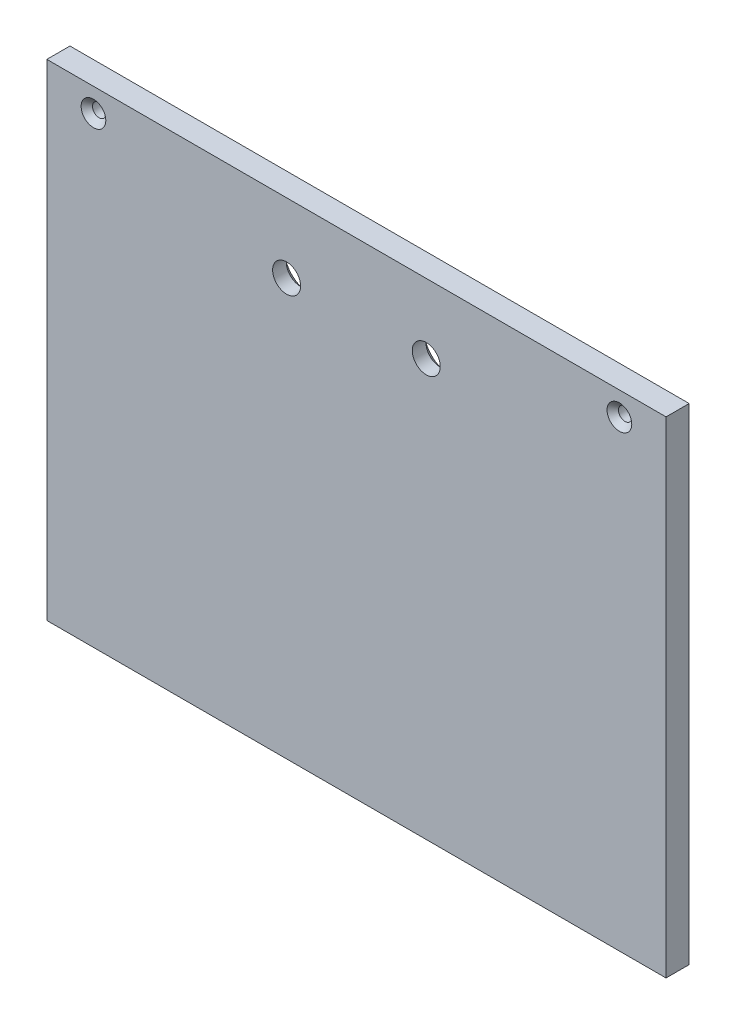
ISO-10303-21;
HEADER;
FILE_DESCRIPTION(('STEP AP214'),'2;1');
FILE_NAME('part.step','',(''),(''),'','','');
FILE_SCHEMA(('AUTOMOTIVE_DESIGN { 1 0 10303 214 1 1 1 1 }'));
ENDSEC;
DATA;
#1=APPLICATION_CONTEXT('core data for automotive mechanical design processes');
#2=APPLICATION_PROTOCOL_DEFINITION('international standard','automotive_design',2000,#1);
#3=PRODUCT_CONTEXT('',#1,'mechanical');
#4=PRODUCT('Part','Part','',(#3));
#5=PRODUCT_RELATED_PRODUCT_CATEGORY('part','',(#4));
#6=PRODUCT_DEFINITION_FORMATION('','',#4);
#7=PRODUCT_DEFINITION_CONTEXT('part definition',#1,'design');
#8=PRODUCT_DEFINITION('design','',#6,#7);
#9=PRODUCT_DEFINITION_SHAPE('','',#8);
#10=(LENGTH_UNIT() NAMED_UNIT(*) SI_UNIT(.MILLI.,.METRE.));
#11=(NAMED_UNIT(*) PLANE_ANGLE_UNIT() SI_UNIT($,.RADIAN.));
#12=(NAMED_UNIT(*) SI_UNIT($,.STERADIAN.) SOLID_ANGLE_UNIT());
#13=UNCERTAINTY_MEASURE_WITH_UNIT(LENGTH_MEASURE(1.E-05),#10,'distance_accuracy_value','');
#14=(GEOMETRIC_REPRESENTATION_CONTEXT(3) GLOBAL_UNCERTAINTY_ASSIGNED_CONTEXT((#13)) GLOBAL_UNIT_ASSIGNED_CONTEXT((#10,
#11,#12)) REPRESENTATION_CONTEXT('',''));
#15=CARTESIAN_POINT('',(0.,0.,0.));
#16=DIRECTION('',(0.,0.,1.));
#17=DIRECTION('',(1.,0.,0.));
#18=AXIS2_PLACEMENT_3D('',#15,#16,#17);
#19=CARTESIAN_POINT('',(79.,62.,5.9));
#20=DIRECTION('',(-1.,0.,0.));
#21=DIRECTION('',(0.,-1.,0.));
#22=AXIS2_PLACEMENT_3D('',#19,#20,#21);
#23=PLANE('',#22);
#24=DIRECTION('',(0.,1.,0.));
#25=VECTOR('',#24,1.);
#26=CARTESIAN_POINT('',(79.,62.,0.));
#27=LINE('',#26,#25);
#28=CARTESIAN_POINT('',(79.,-62.,0.));
#29=VERTEX_POINT('',#28);
#30=CARTESIAN_POINT('',(79.,62.,0.));
#31=VERTEX_POINT('',#30);
#32=EDGE_CURVE('E99',#29,#31,#27,.T.);
#33=ORIENTED_EDGE('',*,*,#32,.T.);
#34=DIRECTION('',(0.,0.,-1.));
#35=VECTOR('',#34,1.);
#36=CARTESIAN_POINT('',(79.,62.,5.9));
#37=LINE('',#36,#35);
#38=CARTESIAN_POINT('',(79.,62.,5.9));
#39=VERTEX_POINT('',#38);
#40=EDGE_CURVE('E11',#39,#31,#37,.T.);
#41=ORIENTED_EDGE('',*,*,#40,.F.);
#42=DIRECTION('',(0.,1.,0.));
#43=VECTOR('',#42,1.);
#44=CARTESIAN_POINT('',(79.,62.,5.9));
#45=LINE('',#44,#43);
#46=CARTESIAN_POINT('',(79.,-62.,5.9));
#47=VERTEX_POINT('',#46);
#48=EDGE_CURVE('E86',#47,#39,#45,.T.);
#49=ORIENTED_EDGE('',*,*,#48,.F.);
#50=DIRECTION('',(0.,0.,-1.));
#51=VECTOR('',#50,1.);
#52=CARTESIAN_POINT('',(79.,-62.,5.9));
#53=LINE('',#52,#51);
#54=EDGE_CURVE('E95',#47,#29,#53,.T.);
#55=ORIENTED_EDGE('',*,*,#54,.T.);
#56=EDGE_LOOP('',(#33,#41,#49,#55));
#57=FACE_BOUND('',#56,.T.);
#58=ADVANCED_FACE('F33',(#57),#23,.F.);
#59=CARTESIAN_POINT('',(-79.,62.,5.9));
#60=DIRECTION('',(0.,-1.,0.));
#61=DIRECTION('',(0.,0.,-1.));
#62=AXIS2_PLACEMENT_3D('',#59,#60,#61);
#63=PLANE('',#62);
#64=DIRECTION('',(-1.,0.,0.));
#65=VECTOR('',#64,1.);
#66=CARTESIAN_POINT('',(-79.,62.,0.));
#67=LINE('',#66,#65);
#68=CARTESIAN_POINT('',(-79.,62.,0.));
#69=VERTEX_POINT('',#68);
#70=EDGE_CURVE('E90',#31,#69,#67,.T.);
#71=ORIENTED_EDGE('',*,*,#70,.T.);
#72=DIRECTION('',(0.,0.,-1.));
#73=VECTOR('',#72,1.);
#74=CARTESIAN_POINT('',(-79.,62.,5.9));
#75=LINE('',#74,#73);
#76=CARTESIAN_POINT('',(-79.,62.,5.9));
#77=VERTEX_POINT('',#76);
#78=EDGE_CURVE('E42',#77,#69,#75,.T.);
#79=ORIENTED_EDGE('',*,*,#78,.F.);
#80=DIRECTION('',(-1.,0.,0.));
#81=VECTOR('',#80,1.);
#82=CARTESIAN_POINT('',(-79.,62.,5.9));
#83=LINE('',#82,#81);
#84=EDGE_CURVE('E81',#39,#77,#83,.T.);
#85=ORIENTED_EDGE('',*,*,#84,.F.);
#86=ORIENTED_EDGE('',*,*,#40,.T.);
#87=EDGE_LOOP('',(#71,#79,#85,#86));
#88=FACE_BOUND('',#87,.T.);
#89=ADVANCED_FACE('F89',(#88),#63,.F.);
#90=CARTESIAN_POINT('',(-79.,62.,5.9));
#91=DIRECTION('',(1.,0.,0.));
#92=DIRECTION('',(0.,0.,-1.));
#93=AXIS2_PLACEMENT_3D('',#90,#91,#92);
#94=PLANE('',#93);
#95=DIRECTION('',(0.,-1.,0.));
#96=VECTOR('',#95,1.);
#97=CARTESIAN_POINT('',(-79.,62.,0.));
#98=LINE('',#97,#96);
#99=CARTESIAN_POINT('',(-79.,-62.,0.));
#100=VERTEX_POINT('',#99);
#101=EDGE_CURVE('E68',#69,#100,#98,.T.);
#102=ORIENTED_EDGE('',*,*,#101,.T.);
#103=DIRECTION('',(0.,0.,-1.));
#104=VECTOR('',#103,1.);
#105=CARTESIAN_POINT('',(-79.,-62.,5.9));
#106=LINE('',#105,#104);
#107=CARTESIAN_POINT('',(-79.,-62.,5.9));
#108=VERTEX_POINT('',#107);
#109=EDGE_CURVE('E91',#108,#100,#106,.T.);
#110=ORIENTED_EDGE('',*,*,#109,.F.);
#111=DIRECTION('',(0.,-1.,0.));
#112=VECTOR('',#111,1.);
#113=CARTESIAN_POINT('',(-79.,62.,5.9));
#114=LINE('',#113,#112);
#115=EDGE_CURVE('E84',#77,#108,#114,.T.);
#116=ORIENTED_EDGE('',*,*,#115,.F.);
#117=ORIENTED_EDGE('',*,*,#78,.T.);
#118=EDGE_LOOP('',(#102,#110,#116,#117));
#119=FACE_BOUND('',#118,.T.);
#120=ADVANCED_FACE('F93',(#119),#94,.F.);
#121=CARTESIAN_POINT('',(-79.,-62.,5.9));
#122=DIRECTION('',(0.,1.,0.));
#123=DIRECTION('',(0.,0.,1.));
#124=AXIS2_PLACEMENT_3D('',#121,#122,#123);
#125=PLANE('',#124);
#126=DIRECTION('',(1.,0.,0.));
#127=VECTOR('',#126,1.);
#128=CARTESIAN_POINT('',(-79.,-62.,0.));
#129=LINE('',#128,#127);
#130=EDGE_CURVE('E74',#100,#29,#129,.T.);
#131=ORIENTED_EDGE('',*,*,#130,.T.);
#132=ORIENTED_EDGE('',*,*,#54,.F.);
#133=DIRECTION('',(1.,0.,0.));
#134=VECTOR('',#133,1.);
#135=CARTESIAN_POINT('',(-79.,-62.,5.9));
#136=LINE('',#135,#134);
#137=EDGE_CURVE('E51',#108,#47,#136,.T.);
#138=ORIENTED_EDGE('',*,*,#137,.F.);
#139=ORIENTED_EDGE('',*,*,#109,.T.);
#140=EDGE_LOOP('',(#131,#132,#138,#139));
#141=FACE_BOUND('',#140,.T.);
#142=ADVANCED_FACE('F158',(#141),#125,.F.);
#143=CARTESIAN_POINT('',(0.,0.,5.9));
#144=DIRECTION('',(0.,0.,1.));
#145=DIRECTION('',(1.,0.,0.));
#146=AXIS2_PLACEMENT_3D('',#143,#144,#145);
#147=PLANE('',#146);
#148=CARTESIAN_POINT('',(-17.81875,44.2682192566038,5.9));
#149=DIRECTION('',(0.,0.,-1.));
#150=DIRECTION('',(-1.,0.,0.));
#151=AXIS2_PLACEMENT_3D('',#148,#149,#150);
#152=CIRCLE('',#151,3.57123999999999);
#153=CARTESIAN_POINT('',(-21.38999,44.2682192566038,5.9));
#154=VERTEX_POINT('',#153);
#155=EDGE_CURVE('E134',#154,#154,#152,.T.);
#156=ORIENTED_EDGE('',*,*,#155,.T.);
#157=EDGE_LOOP('',(#156));
#158=FACE_BOUND('',#157,.T.);
#159=CARTESIAN_POINT('',(17.81875,44.2682192566038,5.9));
#160=DIRECTION('',(0.,0.,-1.));
#161=DIRECTION('',(-1.,0.,0.));
#162=AXIS2_PLACEMENT_3D('',#159,#160,#161);
#163=CIRCLE('',#162,3.57123999999999);
#164=CARTESIAN_POINT('',(14.24751,44.2682192566038,5.9));
#165=VERTEX_POINT('',#164);
#166=EDGE_CURVE('E125',#165,#165,#163,.T.);
#167=ORIENTED_EDGE('',*,*,#166,.T.);
#168=EDGE_LOOP('',(#167));
#169=FACE_BOUND('',#168,.T.);
#170=CARTESIAN_POINT('',(-67.1,56.0000000000001,5.9));
#171=DIRECTION('',(0.,0.,1.));
#172=DIRECTION('',(1.,0.,0.));
#173=AXIS2_PLACEMENT_3D('',#170,#171,#172);
#174=CIRCLE('',#173,3.15);
#175=CARTESIAN_POINT('',(-63.95,56.0000000000001,5.9));
#176=VERTEX_POINT('',#175);
#177=EDGE_CURVE('E122',#176,#176,#174,.T.);
#178=ORIENTED_EDGE('',*,*,#177,.F.);
#179=EDGE_LOOP('',(#178));
#180=FACE_BOUND('',#179,.T.);
#181=CARTESIAN_POINT('',(67.1,56.,5.9));
#182=DIRECTION('',(0.,0.,1.));
#183=DIRECTION('',(1.,0.,0.));
#184=AXIS2_PLACEMENT_3D('',#181,#182,#183);
#185=CIRCLE('',#184,3.15);
#186=CARTESIAN_POINT('',(70.25,56.,5.9));
#187=VERTEX_POINT('',#186);
#188=EDGE_CURVE('E112',#187,#187,#185,.T.);
#189=ORIENTED_EDGE('',*,*,#188,.F.);
#190=EDGE_LOOP('',(#189));
#191=FACE_BOUND('',#190,.T.);
#192=ORIENTED_EDGE('',*,*,#48,.T.);
#193=ORIENTED_EDGE('',*,*,#84,.T.);
#194=ORIENTED_EDGE('',*,*,#115,.T.);
#195=ORIENTED_EDGE('',*,*,#137,.T.);
#196=EDGE_LOOP('',(#192,#193,#194,#195));
#197=FACE_BOUND('',#196,.T.);
#198=ADVANCED_FACE('F82',(#158,#169,#180,#191,#197),#147,.T.);
#199=CARTESIAN_POINT('',(0.,0.,0.));
#200=DIRECTION('',(0.,0.,1.));
#201=DIRECTION('',(1.,0.,0.));
#202=AXIS2_PLACEMENT_3D('',#199,#200,#201);
#203=PLANE('',#202);
#204=CARTESIAN_POINT('',(-17.81875,44.2682192566038,0.));
#205=DIRECTION('',(0.,0.,-1.));
#206=DIRECTION('',(-1.,0.,0.));
#207=AXIS2_PLACEMENT_3D('',#204,#205,#206);
#208=CIRCLE('',#207,6.4389);
#209=CARTESIAN_POINT('',(-24.25765,44.2682192566038,0.));
#210=VERTEX_POINT('',#209);
#211=EDGE_CURVE('E140',#210,#210,#208,.T.);
#212=ORIENTED_EDGE('',*,*,#211,.F.);
#213=EDGE_LOOP('',(#212));
#214=FACE_BOUND('',#213,.T.);
#215=CARTESIAN_POINT('',(17.81875,44.2682192566038,0.));
#216=DIRECTION('',(0.,0.,-1.));
#217=DIRECTION('',(-1.,0.,0.));
#218=AXIS2_PLACEMENT_3D('',#215,#216,#217);
#219=CIRCLE('',#218,6.4389);
#220=CARTESIAN_POINT('',(11.37985,44.2682192566038,0.));
#221=VERTEX_POINT('',#220);
#222=EDGE_CURVE('E131',#221,#221,#219,.T.);
#223=ORIENTED_EDGE('',*,*,#222,.F.);
#224=EDGE_LOOP('',(#223));
#225=FACE_BOUND('',#224,.T.);
#226=CARTESIAN_POINT('',(-67.1,56.0000000000001,0.));
#227=DIRECTION('',(0.,0.,1.));
#228=DIRECTION('',(1.,0.,0.));
#229=AXIS2_PLACEMENT_3D('',#226,#227,#228);
#230=CIRCLE('',#229,1.69999999999999);
#231=CARTESIAN_POINT('',(-65.4,56.0000000000001,0.));
#232=VERTEX_POINT('',#231);
#233=EDGE_CURVE('E36',#232,#232,#230,.T.);
#234=ORIENTED_EDGE('',*,*,#233,.T.);
#235=EDGE_LOOP('',(#234));
#236=FACE_BOUND('',#235,.T.);
#237=CARTESIAN_POINT('',(67.1,56.,0.));
#238=DIRECTION('',(0.,0.,1.));
#239=DIRECTION('',(1.,0.,0.));
#240=AXIS2_PLACEMENT_3D('',#237,#238,#239);
#241=CIRCLE('',#240,1.69999999999999);
#242=CARTESIAN_POINT('',(68.7999999999999,56.,0.));
#243=VERTEX_POINT('',#242);
#244=EDGE_CURVE('E102',#243,#243,#241,.T.);
#245=ORIENTED_EDGE('',*,*,#244,.T.);
#246=EDGE_LOOP('',(#245));
#247=FACE_BOUND('',#246,.T.);
#248=ORIENTED_EDGE('',*,*,#32,.F.);
#249=ORIENTED_EDGE('',*,*,#130,.F.);
#250=ORIENTED_EDGE('',*,*,#101,.F.);
#251=ORIENTED_EDGE('',*,*,#70,.F.);
#252=EDGE_LOOP('',(#248,#249,#250,#251));
#253=FACE_BOUND('',#252,.T.);
#254=ADVANCED_FACE('F146',(#214,#225,#236,#247,#253),#203,.F.);
#255=CARTESIAN_POINT('',(67.1,56.,5.9));
#256=DIRECTION('',(0.,0.,1.));
#257=DIRECTION('',(1.,0.,0.));
#258=AXIS2_PLACEMENT_3D('',#255,#256,#257);
#259=CYLINDRICAL_SURFACE('',#258,1.69999999999999);
#260=CARTESIAN_POINT('',(67.1,56.,4.45));
#261=DIRECTION('',(0.,0.,1.));
#262=DIRECTION('',(1.,0.,0.));
#263=AXIS2_PLACEMENT_3D('',#260,#261,#262);
#264=CIRCLE('',#263,1.69999999999999);
#265=CARTESIAN_POINT('',(68.7999999999999,56.,4.45));
#266=VERTEX_POINT('',#265);
#267=EDGE_CURVE('E108',#266,#266,#264,.T.);
#268=ORIENTED_EDGE('',*,*,#267,.T.);
#269=EDGE_LOOP('',(#268));
#270=FACE_BOUND('',#269,.T.);
#271=ORIENTED_EDGE('',*,*,#244,.F.);
#272=EDGE_LOOP('',(#271));
#273=FACE_BOUND('',#272,.T.);
#274=ADVANCED_FACE('F149',(#270,#273),#259,.F.);
#275=CARTESIAN_POINT('',(67.1,56.,5.9));
#276=DIRECTION('',(0.,0.,1.));
#277=DIRECTION('',(1.,0.,0.));
#278=AXIS2_PLACEMENT_3D('',#275,#276,#277);
#279=CONICAL_SURFACE('',#278,3.15,0.78539816339745);
#280=ORIENTED_EDGE('',*,*,#267,.F.);
#281=EDGE_LOOP('',(#280));
#282=FACE_BOUND('',#281,.T.);
#283=ORIENTED_EDGE('',*,*,#188,.T.);
#284=EDGE_LOOP('',(#283));
#285=FACE_BOUND('',#284,.T.);
#286=ADVANCED_FACE('F192',(#282,#285),#279,.F.);
#287=CARTESIAN_POINT('',(-67.1,56.0000000000001,5.9));
#288=DIRECTION('',(0.,0.,1.));
#289=DIRECTION('',(1.,0.,0.));
#290=AXIS2_PLACEMENT_3D('',#287,#288,#289);
#291=CYLINDRICAL_SURFACE('',#290,1.69999999999999);
#292=CARTESIAN_POINT('',(-67.1,56.0000000000001,4.45));
#293=DIRECTION('',(0.,0.,1.));
#294=DIRECTION('',(1.,0.,0.));
#295=AXIS2_PLACEMENT_3D('',#292,#293,#294);
#296=CIRCLE('',#295,1.69999999999999);
#297=CARTESIAN_POINT('',(-65.4,56.0000000000001,4.45));
#298=VERTEX_POINT('',#297);
#299=EDGE_CURVE('E119',#298,#298,#296,.T.);
#300=ORIENTED_EDGE('',*,*,#299,.T.);
#301=EDGE_LOOP('',(#300));
#302=FACE_BOUND('',#301,.T.);
#303=ORIENTED_EDGE('',*,*,#233,.F.);
#304=EDGE_LOOP('',(#303));
#305=FACE_BOUND('',#304,.T.);
#306=ADVANCED_FACE('F202',(#302,#305),#291,.F.);
#307=CARTESIAN_POINT('',(-67.1,56.0000000000001,5.9));
#308=DIRECTION('',(0.,0.,1.));
#309=DIRECTION('',(1.,0.,0.));
#310=AXIS2_PLACEMENT_3D('',#307,#308,#309);
#311=CONICAL_SURFACE('',#310,3.15,0.78539816339745);
#312=ORIENTED_EDGE('',*,*,#299,.F.);
#313=EDGE_LOOP('',(#312));
#314=FACE_BOUND('',#313,.T.);
#315=ORIENTED_EDGE('',*,*,#177,.T.);
#316=EDGE_LOOP('',(#315));
#317=FACE_BOUND('',#316,.T.);
#318=ADVANCED_FACE('F212',(#314,#317),#311,.F.);
#319=CARTESIAN_POINT('',(17.81875,44.2682192566038,0.));
#320=DIRECTION('',(0.,0.,-1.));
#321=DIRECTION('',(-1.,0.,0.));
#322=AXIS2_PLACEMENT_3D('',#319,#320,#321);
#323=CYLINDRICAL_SURFACE('',#322,3.57123999999999);
#324=ORIENTED_EDGE('',*,*,#166,.F.);
#325=EDGE_LOOP('',(#324));
#326=FACE_BOUND('',#325,.T.);
#327=CARTESIAN_POINT('',(17.81875,44.2682192566038,2.40625244834184));
#328=DIRECTION('',(0.,0.,-1.));
#329=DIRECTION('',(-1.,0.,0.));
#330=AXIS2_PLACEMENT_3D('',#327,#328,#329);
#331=CIRCLE('',#330,3.57124);
#332=CARTESIAN_POINT('',(14.24751,44.2682192566038,2.40625244834184));
#333=VERTEX_POINT('',#332);
#334=EDGE_CURVE('E128',#333,#333,#331,.T.);
#335=ORIENTED_EDGE('',*,*,#334,.T.);
#336=EDGE_LOOP('',(#335));
#337=FACE_BOUND('',#336,.T.);
#338=ADVANCED_FACE('F222',(#326,#337),#323,.F.);
#339=CARTESIAN_POINT('',(17.81875,44.2682192566038,0.));
#340=DIRECTION('',(0.,0.,-1.));
#341=DIRECTION('',(-1.,0.,0.));
#342=AXIS2_PLACEMENT_3D('',#339,#340,#341);
#343=CONICAL_SURFACE('',#342,6.4389,0.872664625997165);
#344=ORIENTED_EDGE('',*,*,#334,.F.);
#345=EDGE_LOOP('',(#344));
#346=FACE_BOUND('',#345,.T.);
#347=ORIENTED_EDGE('',*,*,#222,.T.);
#348=EDGE_LOOP('',(#347));
#349=FACE_BOUND('',#348,.T.);
#350=ADVANCED_FACE('F242',(#346,#349),#343,.F.);
#351=CARTESIAN_POINT('',(-17.81875,44.2682192566038,0.));
#352=DIRECTION('',(0.,0.,-1.));
#353=DIRECTION('',(-1.,0.,0.));
#354=AXIS2_PLACEMENT_3D('',#351,#352,#353);
#355=CYLINDRICAL_SURFACE('',#354,3.57123999999999);
#356=ORIENTED_EDGE('',*,*,#155,.F.);
#357=EDGE_LOOP('',(#356));
#358=FACE_BOUND('',#357,.T.);
#359=CARTESIAN_POINT('',(-17.81875,44.2682192566038,2.40625244834184));
#360=DIRECTION('',(0.,0.,-1.));
#361=DIRECTION('',(-1.,0.,0.));
#362=AXIS2_PLACEMENT_3D('',#359,#360,#361);
#363=CIRCLE('',#362,3.57124);
#364=CARTESIAN_POINT('',(-21.38999,44.2682192566038,2.40625244834184));
#365=VERTEX_POINT('',#364);
#366=EDGE_CURVE('E137',#365,#365,#363,.T.);
#367=ORIENTED_EDGE('',*,*,#366,.T.);
#368=EDGE_LOOP('',(#367));
#369=FACE_BOUND('',#368,.T.);
#370=ADVANCED_FACE('F252',(#358,#369),#355,.F.);
#371=CARTESIAN_POINT('',(-17.81875,44.2682192566038,0.));
#372=DIRECTION('',(0.,0.,-1.));
#373=DIRECTION('',(-1.,0.,0.));
#374=AXIS2_PLACEMENT_3D('',#371,#372,#373);
#375=CONICAL_SURFACE('',#374,6.4389,0.872664625997165);
#376=ORIENTED_EDGE('',*,*,#366,.F.);
#377=EDGE_LOOP('',(#376));
#378=FACE_BOUND('',#377,.T.);
#379=ORIENTED_EDGE('',*,*,#211,.T.);
#380=EDGE_LOOP('',(#379));
#381=FACE_BOUND('',#380,.T.);
#382=ADVANCED_FACE('F144',(#378,#381),#375,.F.);
#383=CLOSED_SHELL('',(#58,#89,#120,#142,#198,#254,#274,#286,#306,#318,#338,#350,#370,#382));
#384=MANIFOLD_SOLID_BREP('B2',#383);
#385=ADVANCED_BREP_SHAPE_REPRESENTATION('',(#18,#384),#14);
#386=SHAPE_DEFINITION_REPRESENTATION(#9,#385);
ENDSEC;
END-ISO-10303-21;
